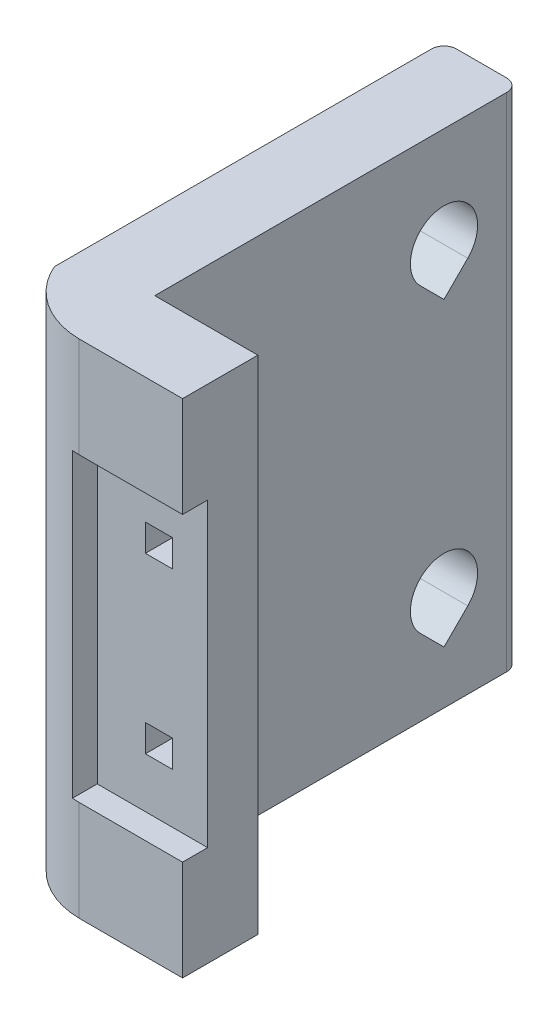
ISO-10303-21;
HEADER;
FILE_DESCRIPTION(('STEP AP214'),'2;1');
FILE_NAME('part.step','',(''),(''),'','','');
FILE_SCHEMA(('AUTOMOTIVE_DESIGN { 1 0 10303 214 1 1 1 1 }'));
ENDSEC;
DATA;
#1=APPLICATION_CONTEXT('core data for automotive mechanical design processes');
#2=APPLICATION_PROTOCOL_DEFINITION('international standard','automotive_design',2000,#1);
#3=PRODUCT_CONTEXT('',#1,'mechanical');
#4=PRODUCT('Part','Part','',(#3));
#5=PRODUCT_RELATED_PRODUCT_CATEGORY('part','',(#4));
#6=PRODUCT_DEFINITION_FORMATION('','',#4);
#7=PRODUCT_DEFINITION_CONTEXT('part definition',#1,'design');
#8=PRODUCT_DEFINITION('design','',#6,#7);
#9=PRODUCT_DEFINITION_SHAPE('','',#8);
#10=(LENGTH_UNIT() NAMED_UNIT(*) SI_UNIT(.MILLI.,.METRE.));
#11=(NAMED_UNIT(*) PLANE_ANGLE_UNIT() SI_UNIT($,.RADIAN.));
#12=(NAMED_UNIT(*) SI_UNIT($,.STERADIAN.) SOLID_ANGLE_UNIT());
#13=UNCERTAINTY_MEASURE_WITH_UNIT(LENGTH_MEASURE(1.E-05),#10,'distance_accuracy_value','');
#14=(GEOMETRIC_REPRESENTATION_CONTEXT(3) GLOBAL_UNCERTAINTY_ASSIGNED_CONTEXT((#13)) GLOBAL_UNIT_ASSIGNED_CONTEXT((#10,
#11,#12)) REPRESENTATION_CONTEXT('',''));
#15=CARTESIAN_POINT('',(0.,0.,0.));
#16=DIRECTION('',(0.,0.,1.));
#17=DIRECTION('',(1.,0.,0.));
#18=AXIS2_PLACEMENT_3D('',#15,#16,#17);
#19=CARTESIAN_POINT('',(16.5393794749403,100.,20.3051089855569));
#20=DIRECTION('',(0.,0.,-1.));
#21=DIRECTION('',(-1.,0.,0.));
#22=AXIS2_PLACEMENT_3D('',#19,#20,#21);
#23=PLANE('',#22);
#24=DIRECTION('',(0.,-1.,0.));
#25=VECTOR('',#24,1.);
#26=CARTESIAN_POINT('',(37.0851262229075,100.,20.3051089855569));
#27=LINE('',#26,#25);
#28=CARTESIAN_POINT('',(37.0851262229075,20.,20.3051089855569));
#29=VERTEX_POINT('',#28);
#30=CARTESIAN_POINT('',(37.0851262229075,0.,20.3051089855569));
#31=VERTEX_POINT('',#30);
#32=EDGE_CURVE('E435',#29,#31,#27,.T.);
#33=ORIENTED_EDGE('',*,*,#32,.F.);
#34=DIRECTION('',(1.,0.,0.));
#35=VECTOR('',#34,1.);
#36=CARTESIAN_POINT('',(37.0851262229075,20.,20.3051089855569));
#37=LINE('',#36,#35);
#38=CARTESIAN_POINT('',(16.4627404365741,20.,20.3051089855569));
#39=VERTEX_POINT('',#38);
#40=EDGE_CURVE('E256',#39,#29,#37,.T.);
#41=ORIENTED_EDGE('',*,*,#40,.F.);
#42=DIRECTION('',(0.,-1.,0.));
#43=VECTOR('',#42,1.);
#44=CARTESIAN_POINT('',(16.4627404365741,100.,20.3051089855569));
#45=LINE('',#44,#43);
#46=CARTESIAN_POINT('',(16.4627404365741,0.,20.3051089855569));
#47=VERTEX_POINT('',#46);
#48=EDGE_CURVE('E438',#39,#47,#45,.T.);
#49=ORIENTED_EDGE('',*,*,#48,.T.);
#50=DIRECTION('',(1.,0.,0.));
#51=VECTOR('',#50,1.);
#52=CARTESIAN_POINT('',(16.5393794749403,0.,20.3051089855569));
#53=LINE('',#52,#51);
#54=EDGE_CURVE('E413',#47,#31,#53,.T.);
#55=ORIENTED_EDGE('',*,*,#54,.T.);
#56=EDGE_LOOP('',(#33,#41,#49,#55));
#57=FACE_BOUND('',#56,.T.);
#58=ADVANCED_FACE('F45',(#57),#23,.F.);
#59=CARTESIAN_POINT('',(1.5393794749403,100.,10.3051089855569));
#60=DIRECTION('',(1.,0.,0.));
#61=DIRECTION('',(0.,0.,-1.));
#62=AXIS2_PLACEMENT_3D('',#59,#60,#61);
#63=PLANE('',#62);
#64=DIRECTION('',(0.,-0.707106781186553,0.707106781186542));
#65=VECTOR('',#64,1.);
#66=CARTESIAN_POINT('',(1.5393794749403,70.5247691321003,-52.3448910144431));
#67=LINE('',#66,#65);
#68=CARTESIAN_POINT('',(1.53937947494029,75.2623845660502,-57.082506448393));
#69=VERTEX_POINT('',#68);
#70=CARTESIAN_POINT('',(1.5393794749403,70.5247691321003,-52.3448910144431));
#71=VERTEX_POINT('',#70);
#72=EDGE_CURVE('E345',#69,#71,#67,.T.);
#73=ORIENTED_EDGE('',*,*,#72,.F.);
#74=CARTESIAN_POINT('',(1.5393794749403,80.,-52.3448910144431));
#75=DIRECTION('',(-1.,0.,0.));
#76=DIRECTION('',(0.,0.,1.));
#77=AXIS2_PLACEMENT_3D('',#74,#75,#76);
#78=CIRCLE('',#77,6.69999999999996);
#79=CARTESIAN_POINT('',(1.5393794749403,75.2623845660501,-47.6072755804933));
#80=VERTEX_POINT('',#79);
#81=EDGE_CURVE('E342',#80,#69,#78,.T.);
#82=ORIENTED_EDGE('',*,*,#81,.F.);
#83=DIRECTION('',(0.,0.707106781186546,0.707106781186549));
#84=VECTOR('',#83,1.);
#85=CARTESIAN_POINT('',(1.5393794749403,75.2623845660501,-47.6072755804933));
#86=LINE('',#85,#84);
#87=EDGE_CURVE('E350',#71,#80,#86,.T.);
#88=ORIENTED_EDGE('',*,*,#87,.F.);
#89=EDGE_LOOP('',(#73,#82,#88));
#90=FACE_BOUND('',#89,.T.);
#91=DIRECTION('',(0.,0.707106781186551,0.707106781186544));
#92=VECTOR('',#91,1.);
#93=CARTESIAN_POINT('',(1.5393794749403,10.5247691321002,-52.3448910144431));
#94=LINE('',#93,#92);
#95=CARTESIAN_POINT('',(1.53937947494029,10.5247691321002,-52.3448910144431));
#96=VERTEX_POINT('',#95);
#97=CARTESIAN_POINT('',(1.5393794749403,15.2623845660502,-47.6072755804932));
#98=VERTEX_POINT('',#97);
#99=EDGE_CURVE('E378',#96,#98,#94,.T.);
#100=ORIENTED_EDGE('',*,*,#99,.F.);
#101=DIRECTION('',(0.,-0.707106781186551,0.707106781186544));
#102=VECTOR('',#101,1.);
#103=CARTESIAN_POINT('',(1.5393794749403,10.5247691321002,-52.3448910144431));
#104=LINE('',#103,#102);
#105=CARTESIAN_POINT('',(1.5393794749403,15.2623845660502,-57.082506448393));
#106=VERTEX_POINT('',#105);
#107=EDGE_CURVE('E346',#106,#96,#104,.T.);
#108=ORIENTED_EDGE('',*,*,#107,.F.);
#109=CARTESIAN_POINT('',(1.5393794749403,20.,-52.3448910144431));
#110=DIRECTION('',(-1.,0.,0.));
#111=DIRECTION('',(0.,0.,-1.));
#112=AXIS2_PLACEMENT_3D('',#109,#110,#111);
#113=CIRCLE('',#112,6.7);
#114=EDGE_CURVE('E369',#98,#106,#113,.T.);
#115=ORIENTED_EDGE('',*,*,#114,.F.);
#116=EDGE_LOOP('',(#100,#108,#115));
#117=FACE_BOUND('',#116,.T.);
#118=DIRECTION('',(0.,0.,1.));
#119=VECTOR('',#118,1.);
#120=CARTESIAN_POINT('',(1.5393794749403,100.,10.3051089855569));
#121=LINE('',#120,#119);
#122=CARTESIAN_POINT('',(1.53937947494029,100.,-64.8448910144431));
#123=VERTEX_POINT('',#122);
#124=CARTESIAN_POINT('',(1.5393794749403,100.,10.3051089855569));
#125=VERTEX_POINT('',#124);
#126=EDGE_CURVE('E384',#123,#125,#121,.T.);
#127=ORIENTED_EDGE('',*,*,#126,.F.);
#128=DIRECTION('',(0.,-1.,0.));
#129=VECTOR('',#128,1.);
#130=CARTESIAN_POINT('',(1.53937947494029,100.,-64.8448910144431));
#131=LINE('',#130,#129);
#132=CARTESIAN_POINT('',(1.53937947494029,0.,-64.8448910144431));
#133=VERTEX_POINT('',#132);
#134=EDGE_CURVE('E511',#123,#133,#131,.T.);
#135=ORIENTED_EDGE('',*,*,#134,.T.);
#136=DIRECTION('',(0.,0.,1.));
#137=VECTOR('',#136,1.);
#138=CARTESIAN_POINT('',(1.5393794749403,0.,10.3051089855569));
#139=LINE('',#138,#137);
#140=CARTESIAN_POINT('',(1.5393794749403,0.,10.3051089855569));
#141=VERTEX_POINT('',#140);
#142=EDGE_CURVE('E358',#133,#141,#139,.T.);
#143=ORIENTED_EDGE('',*,*,#142,.T.);
#144=DIRECTION('',(0.,-1.,0.));
#145=VECTOR('',#144,1.);
#146=CARTESIAN_POINT('',(1.5393794749403,100.,10.3051089855569));
#147=LINE('',#146,#145);
#148=EDGE_CURVE('E443',#125,#141,#147,.T.);
#149=ORIENTED_EDGE('',*,*,#148,.F.);
#150=EDGE_LOOP('',(#127,#135,#143,#149));
#151=FACE_BOUND('',#150,.T.);
#152=ADVANCED_FACE('F539',(#90,#117,#151),#63,.F.);
#153=CARTESIAN_POINT('',(16.733940297207,100.,3.7650525246991));
#154=DIRECTION('',(0.,-1.,0.));
#155=DIRECTION('',(0.,0.,-1.));
#156=AXIS2_PLACEMENT_3D('',#153,#154,#155);
#157=CYLINDRICAL_SURFACE('',#156,16.5422796824612);
#158=ORIENTED_EDGE('',*,*,#48,.F.);
#159=CARTESIAN_POINT('',(16.733940297207,20.,3.7650525246991));
#160=DIRECTION('',(0.,-1.,0.));
#161=DIRECTION('',(0.,0.,-1.));
#162=AXIS2_PLACEMENT_3D('',#159,#160,#161);
#163=CIRCLE('',#162,16.5422796824612);
#164=CARTESIAN_POINT('',(15.0851262229075,20.,20.2249562073202));
#165=VERTEX_POINT('',#164);
#166=EDGE_CURVE('E305',#39,#165,#163,.T.);
#167=ORIENTED_EDGE('',*,*,#166,.T.);
#168=DIRECTION('',(0.,-1.,0.));
#169=VECTOR('',#168,1.);
#170=CARTESIAN_POINT('',(15.0851262229075,100.,20.2249562073202));
#171=LINE('',#170,#169);
#172=CARTESIAN_POINT('',(15.0851262229075,80.,20.2249562073202));
#173=VERTEX_POINT('',#172);
#174=EDGE_CURVE('E507',#165,#173,#171,.F.);
#175=ORIENTED_EDGE('',*,*,#174,.T.);
#176=CARTESIAN_POINT('',(16.733940297207,80.,3.7650525246991));
#177=DIRECTION('',(0.,1.,0.));
#178=DIRECTION('',(0.,0.,1.));
#179=AXIS2_PLACEMENT_3D('',#176,#177,#178);
#180=CIRCLE('',#179,16.5422796824612);
#181=CARTESIAN_POINT('',(16.4627404365741,80.,20.3051089855569));
#182=VERTEX_POINT('',#181);
#183=EDGE_CURVE('E301',#173,#182,#180,.T.);
#184=ORIENTED_EDGE('',*,*,#183,.T.);
#185=CARTESIAN_POINT('',(16.4627404365741,100.,20.3051089855569));
#186=VERTEX_POINT('',#185);
#187=EDGE_CURVE('E439',#186,#182,#45,.T.);
#188=ORIENTED_EDGE('',*,*,#187,.F.);
#189=CARTESIAN_POINT('',(16.733940297207,100.,3.7650525246991));
#190=DIRECTION('',(0.,1.,0.));
#191=DIRECTION('',(0.,0.,-1.));
#192=AXIS2_PLACEMENT_3D('',#189,#190,#191);
#193=CIRCLE('',#192,16.5422796824612);
#194=EDGE_CURVE('E387',#125,#186,#193,.T.);
#195=ORIENTED_EDGE('',*,*,#194,.F.);
#196=ORIENTED_EDGE('',*,*,#148,.T.);
#197=CARTESIAN_POINT('',(16.733940297207,0.,3.7650525246991));
#198=DIRECTION('',(0.,1.,0.));
#199=DIRECTION('',(0.,0.,-1.));
#200=AXIS2_PLACEMENT_3D('',#197,#198,#199);
#201=CIRCLE('',#200,16.5422796824612);
#202=EDGE_CURVE('E409',#141,#47,#201,.T.);
#203=ORIENTED_EDGE('',*,*,#202,.T.);
#204=EDGE_LOOP('',(#158,#167,#175,#184,#188,#195,#196,#203));
#205=FACE_BOUND('',#204,.T.);
#206=ADVANCED_FACE('F581',(#205),#157,.T.);
#207=ORIENTED_EDGE('',*,*,#187,.T.);
#208=DIRECTION('',(-1.,0.,0.));
#209=VECTOR('',#208,1.);
#210=CARTESIAN_POINT('',(37.0851262229075,80.,20.3051089855569));
#211=LINE('',#210,#209);
#212=CARTESIAN_POINT('',(37.0851262229075,80.,20.3051089855569));
#213=VERTEX_POINT('',#212);
#214=EDGE_CURVE('E575',#213,#182,#211,.T.);
#215=ORIENTED_EDGE('',*,*,#214,.F.);
#216=CARTESIAN_POINT('',(37.0851262229075,100.,20.3051089855569));
#217=VERTEX_POINT('',#216);
#218=EDGE_CURVE('E262',#217,#213,#27,.T.);
#219=ORIENTED_EDGE('',*,*,#218,.F.);
#220=DIRECTION('',(1.,0.,0.));
#221=VECTOR('',#220,1.);
#222=CARTESIAN_POINT('',(16.5393794749403,100.,20.3051089855569));
#223=LINE('',#222,#221);
#224=EDGE_CURVE('E391',#186,#217,#223,.T.);
#225=ORIENTED_EDGE('',*,*,#224,.F.);
#226=EDGE_LOOP('',(#207,#215,#219,#225));
#227=FACE_BOUND('',#226,.T.);
#228=ADVANCED_FACE('F598',(#227),#23,.F.);
#229=CARTESIAN_POINT('',(37.0851262229075,100.,20.3051089855569));
#230=DIRECTION('',(-1.,0.,0.));
#231=DIRECTION('',(0.,0.,1.));
#232=AXIS2_PLACEMENT_3D('',#229,#230,#231);
#233=PLANE('',#232);
#234=DIRECTION('',(0.,1.,0.));
#235=VECTOR('',#234,1.);
#236=CARTESIAN_POINT('',(37.0851262229075,80.,15.3051089855569));
#237=LINE('',#236,#235);
#238=CARTESIAN_POINT('',(37.0851262229075,20.,15.3051089855569));
#239=VERTEX_POINT('',#238);
#240=CARTESIAN_POINT('',(37.0851262229075,80.,15.3051089855569));
#241=VERTEX_POINT('',#240);
#242=EDGE_CURVE('E245',#239,#241,#237,.T.);
#243=ORIENTED_EDGE('',*,*,#242,.F.);
#244=DIRECTION('',(0.,0.,1.));
#245=VECTOR('',#244,1.);
#246=CARTESIAN_POINT('',(37.0851262229075,20.,15.3051089855569));
#247=LINE('',#246,#245);
#248=EDGE_CURVE('E277',#239,#29,#247,.T.);
#249=ORIENTED_EDGE('',*,*,#248,.T.);
#250=ORIENTED_EDGE('',*,*,#32,.T.);
#251=DIRECTION('',(0.,0.,-1.));
#252=VECTOR('',#251,1.);
#253=CARTESIAN_POINT('',(37.0851262229075,0.,20.3051089855569));
#254=LINE('',#253,#252);
#255=CARTESIAN_POINT('',(37.0851262229075,0.,5.30510898555687));
#256=VERTEX_POINT('',#255);
#257=EDGE_CURVE('E417',#31,#256,#254,.T.);
#258=ORIENTED_EDGE('',*,*,#257,.T.);
#259=DIRECTION('',(0.,-1.,0.));
#260=VECTOR('',#259,1.);
#261=CARTESIAN_POINT('',(37.0851262229075,100.,5.30510898555687));
#262=LINE('',#261,#260);
#263=CARTESIAN_POINT('',(37.0851262229075,100.,5.30510898555687));
#264=VERTEX_POINT('',#263);
#265=EDGE_CURVE('E431',#264,#256,#262,.T.);
#266=ORIENTED_EDGE('',*,*,#265,.F.);
#267=DIRECTION('',(0.,0.,-1.));
#268=VECTOR('',#267,1.);
#269=CARTESIAN_POINT('',(37.0851262229075,100.,20.3051089855569));
#270=LINE('',#269,#268);
#271=EDGE_CURVE('E394',#217,#264,#270,.T.);
#272=ORIENTED_EDGE('',*,*,#271,.F.);
#273=ORIENTED_EDGE('',*,*,#218,.T.);
#274=DIRECTION('',(0.,0.,1.));
#275=VECTOR('',#274,1.);
#276=CARTESIAN_POINT('',(37.0851262229075,80.,15.3051089855569));
#277=LINE('',#276,#275);
#278=EDGE_CURVE('E236',#241,#213,#277,.T.);
#279=ORIENTED_EDGE('',*,*,#278,.F.);
#280=EDGE_LOOP('',(#243,#249,#250,#258,#266,#272,#273,#279));
#281=FACE_BOUND('',#280,.T.);
#282=ADVANCED_FACE('F259',(#281),#233,.F.);
#283=CARTESIAN_POINT('',(16.5393794749403,100.,5.30510898555687));
#284=DIRECTION('',(0.,0.,1.));
#285=DIRECTION('',(1.,0.,0.));
#286=AXIS2_PLACEMENT_3D('',#283,#284,#285);
#287=PLANE('',#286);
#288=DIRECTION('',(-1.,0.,0.));
#289=VECTOR('',#288,1.);
#290=CARTESIAN_POINT('',(16.5393794749403,35.4,5.30510898555687));
#291=LINE('',#290,#289);
#292=CARTESIAN_POINT('',(30.0851262229075,35.4,5.30510898555687));
#293=VERTEX_POINT('',#292);
#294=CARTESIAN_POINT('',(24.6851262229075,35.4,5.30510898555687));
#295=VERTEX_POINT('',#294);
#296=EDGE_CURVE('E495',#293,#295,#291,.T.);
#297=ORIENTED_EDGE('',*,*,#296,.T.);
#298=DIRECTION('',(0.,-1.,0.));
#299=VECTOR('',#298,1.);
#300=CARTESIAN_POINT('',(24.6851262229075,100.,5.30510898555687));
#301=LINE('',#300,#299);
#302=CARTESIAN_POINT('',(24.6851262229075,30.,5.30510898555687));
#303=VERTEX_POINT('',#302);
#304=EDGE_CURVE('E499',#295,#303,#301,.T.);
#305=ORIENTED_EDGE('',*,*,#304,.T.);
#306=DIRECTION('',(1.,0.,0.));
#307=VECTOR('',#306,1.);
#308=CARTESIAN_POINT('',(16.5393794749403,30.,5.30510898555687));
#309=LINE('',#308,#307);
#310=CARTESIAN_POINT('',(30.0851262229075,30.,5.30510898555687));
#311=VERTEX_POINT('',#310);
#312=EDGE_CURVE('E487',#303,#311,#309,.T.);
#313=ORIENTED_EDGE('',*,*,#312,.T.);
#314=DIRECTION('',(0.,1.,0.));
#315=VECTOR('',#314,1.);
#316=CARTESIAN_POINT('',(30.0851262229075,100.,5.30510898555687));
#317=LINE('',#316,#315);
#318=EDGE_CURVE('E491',#311,#293,#317,.T.);
#319=ORIENTED_EDGE('',*,*,#318,.T.);
#320=EDGE_LOOP('',(#297,#305,#313,#319));
#321=FACE_BOUND('',#320,.T.);
#322=DIRECTION('',(0.,-1.,0.));
#323=VECTOR('',#322,1.);
#324=CARTESIAN_POINT('',(24.6851262229075,100.,5.30510898555687));
#325=LINE('',#324,#323);
#326=CARTESIAN_POINT('',(24.6851262229075,70.,5.30510898555687));
#327=VERTEX_POINT('',#326);
#328=CARTESIAN_POINT('',(24.6851262229075,64.6,5.30510898555687));
#329=VERTEX_POINT('',#328);
#330=EDGE_CURVE('E479',#327,#329,#325,.T.);
#331=ORIENTED_EDGE('',*,*,#330,.T.);
#332=DIRECTION('',(1.,0.,0.));
#333=VECTOR('',#332,1.);
#334=CARTESIAN_POINT('',(16.5393794749404,64.6,5.30510898555687));
#335=LINE('',#334,#333);
#336=CARTESIAN_POINT('',(30.0851262229075,64.6,5.30510898555687));
#337=VERTEX_POINT('',#336);
#338=EDGE_CURVE('E483',#329,#337,#335,.T.);
#339=ORIENTED_EDGE('',*,*,#338,.T.);
#340=DIRECTION('',(0.,1.,0.));
#341=VECTOR('',#340,1.);
#342=CARTESIAN_POINT('',(30.0851262229075,100.,5.30510898555687));
#343=LINE('',#342,#341);
#344=CARTESIAN_POINT('',(30.0851262229075,70.,5.30510898555687));
#345=VERTEX_POINT('',#344);
#346=EDGE_CURVE('E471',#337,#345,#343,.T.);
#347=ORIENTED_EDGE('',*,*,#346,.T.);
#348=DIRECTION('',(-1.,0.,0.));
#349=VECTOR('',#348,1.);
#350=CARTESIAN_POINT('',(16.5393794749403,70.,5.30510898555687));
#351=LINE('',#350,#349);
#352=EDGE_CURVE('E475',#345,#327,#351,.T.);
#353=ORIENTED_EDGE('',*,*,#352,.T.);
#354=EDGE_LOOP('',(#331,#339,#347,#353));
#355=FACE_BOUND('',#354,.T.);
#356=DIRECTION('',(-1.,0.,0.));
#357=VECTOR('',#356,1.);
#358=CARTESIAN_POINT('',(16.5393794749403,0.,5.30510898555687));
#359=LINE('',#358,#357);
#360=CARTESIAN_POINT('',(16.5393794749403,0.,5.30510898555687));
#361=VERTEX_POINT('',#360);
#362=EDGE_CURVE('E420',#256,#361,#359,.T.);
#363=ORIENTED_EDGE('',*,*,#362,.T.);
#364=DIRECTION('',(0.,-1.,0.));
#365=VECTOR('',#364,1.);
#366=CARTESIAN_POINT('',(16.5393794749403,100.,5.30510898555687));
#367=LINE('',#366,#365);
#368=CARTESIAN_POINT('',(16.5393794749403,100.,5.30510898555687));
#369=VERTEX_POINT('',#368);
#370=EDGE_CURVE('E406',#369,#361,#367,.T.);
#371=ORIENTED_EDGE('',*,*,#370,.F.);
#372=DIRECTION('',(-1.,0.,0.));
#373=VECTOR('',#372,1.);
#374=CARTESIAN_POINT('',(16.5393794749403,100.,5.30510898555687));
#375=LINE('',#374,#373);
#376=EDGE_CURVE('E397',#264,#369,#375,.T.);
#377=ORIENTED_EDGE('',*,*,#376,.F.);
#378=ORIENTED_EDGE('',*,*,#265,.T.);
#379=EDGE_LOOP('',(#363,#371,#377,#378));
#380=FACE_BOUND('',#379,.T.);
#381=ADVANCED_FACE('F556',(#321,#355,#380),#287,.F.);
#382=CARTESIAN_POINT('',(16.5393794749403,100.,5.30510898555687));
#383=DIRECTION('',(-1.,0.,0.));
#384=DIRECTION('',(0.,0.,1.));
#385=AXIS2_PLACEMENT_3D('',#382,#383,#384);
#386=PLANE('',#385);
#387=DIRECTION('',(0.,0.707106781186546,0.707106781186549));
#388=VECTOR('',#387,1.);
#389=CARTESIAN_POINT('',(16.5393794749403,114.08738456605,-8.78227558049314));
#390=LINE('',#389,#388);
#391=CARTESIAN_POINT('',(16.5393794749403,70.5247691321003,-52.3448910144431));
#392=VERTEX_POINT('',#391);
#393=CARTESIAN_POINT('',(16.5393794749403,75.2623845660501,-47.6072755804933));
#394=VERTEX_POINT('',#393);
#395=EDGE_CURVE('E463',#392,#394,#390,.T.);
#396=ORIENTED_EDGE('',*,*,#395,.T.);
#397=CARTESIAN_POINT('',(16.5393794749403,80.,-52.3448910144431));
#398=DIRECTION('',(-1.,0.,0.));
#399=DIRECTION('',(0.,0.,1.));
#400=AXIS2_PLACEMENT_3D('',#397,#398,#399);
#401=CIRCLE('',#400,6.69999999999996);
#402=CARTESIAN_POINT('',(16.5393794749403,75.2623845660502,-57.082506448393));
#403=VERTEX_POINT('',#402);
#404=EDGE_CURVE('E467',#394,#403,#401,.T.);
#405=ORIENTED_EDGE('',*,*,#404,.T.);
#406=DIRECTION('',(0.,-0.707106781186553,0.707106781186542));
#407=VECTOR('',#406,1.);
#408=CARTESIAN_POINT('',(16.5393794749403,56.4373845660504,-38.2575064483934));
#409=LINE('',#408,#407);
#410=EDGE_CURVE('E459',#403,#392,#409,.T.);
#411=ORIENTED_EDGE('',*,*,#410,.T.);
#412=EDGE_LOOP('',(#396,#405,#411));
#413=FACE_BOUND('',#412,.T.);
#414=CARTESIAN_POINT('',(16.5393794749403,20.,-52.3448910144431));
#415=DIRECTION('',(-1.,0.,0.));
#416=DIRECTION('',(0.,0.,1.));
#417=AXIS2_PLACEMENT_3D('',#414,#415,#416);
#418=CIRCLE('',#417,6.7);
#419=CARTESIAN_POINT('',(16.5393794749403,15.2623845660502,-47.6072755804932));
#420=VERTEX_POINT('',#419);
#421=CARTESIAN_POINT('',(16.5393794749403,15.2623845660502,-57.082506448393));
#422=VERTEX_POINT('',#421);
#423=EDGE_CURVE('E451',#420,#422,#418,.T.);
#424=ORIENTED_EDGE('',*,*,#423,.T.);
#425=DIRECTION('',(0.,-0.707106781186551,0.707106781186544));
#426=VECTOR('',#425,1.);
#427=CARTESIAN_POINT('',(16.5393794749403,26.4373845660506,-68.2575064483933));
#428=LINE('',#427,#426);
#429=CARTESIAN_POINT('',(16.5393794749403,10.5247691321002,-52.3448910144431));
#430=VERTEX_POINT('',#429);
#431=EDGE_CURVE('E455',#422,#430,#428,.T.);
#432=ORIENTED_EDGE('',*,*,#431,.T.);
#433=DIRECTION('',(0.,0.707106781186551,0.707106781186544));
#434=VECTOR('',#433,1.);
#435=CARTESIAN_POINT('',(16.5393794749403,84.0873845660506,21.2177244195065));
#436=LINE('',#435,#434);
#437=EDGE_CURVE('E447',#430,#420,#436,.T.);
#438=ORIENTED_EDGE('',*,*,#437,.T.);
#439=EDGE_LOOP('',(#424,#432,#438));
#440=FACE_BOUND('',#439,.T.);
#441=DIRECTION('',(0.,0.,-1.));
#442=VECTOR('',#441,1.);
#443=CARTESIAN_POINT('',(16.5393794749403,0.,5.30510898555687));
#444=LINE('',#443,#442);
#445=CARTESIAN_POINT('',(16.5393794749403,0.,-64.8448910144431));
#446=VERTEX_POINT('',#445);
#447=EDGE_CURVE('E423',#361,#446,#444,.T.);
#448=ORIENTED_EDGE('',*,*,#447,.T.);
#449=DIRECTION('',(0.,-1.,0.));
#450=VECTOR('',#449,1.);
#451=CARTESIAN_POINT('',(16.5393794749403,100.,-64.8448910144431));
#452=LINE('',#451,#450);
#453=CARTESIAN_POINT('',(16.5393794749403,100.,-64.8448910144431));
#454=VERTEX_POINT('',#453);
#455=EDGE_CURVE('E11',#446,#454,#452,.F.);
#456=ORIENTED_EDGE('',*,*,#455,.T.);
#457=DIRECTION('',(0.,0.,-1.));
#458=VECTOR('',#457,1.);
#459=CARTESIAN_POINT('',(16.5393794749403,100.,5.30510898555687));
#460=LINE('',#459,#458);
#461=EDGE_CURVE('E400',#369,#454,#460,.T.);
#462=ORIENTED_EDGE('',*,*,#461,.F.);
#463=ORIENTED_EDGE('',*,*,#370,.T.);
#464=EDGE_LOOP('',(#448,#456,#462,#463));
#465=FACE_BOUND('',#464,.T.);
#466=ADVANCED_FACE('F552',(#413,#440,#465),#386,.F.);
#467=CARTESIAN_POINT('',(16.5393794749403,100.,-67.3448910144431));
#468=DIRECTION('',(0.,0.,1.));
#469=DIRECTION('',(1.,0.,0.));
#470=AXIS2_PLACEMENT_3D('',#467,#468,#469);
#471=PLANE('',#470);
#472=DIRECTION('',(-1.,0.,0.));
#473=VECTOR('',#472,1.);
#474=CARTESIAN_POINT('',(16.5393794749403,0.,-67.3448910144431));
#475=LINE('',#474,#473);
#476=CARTESIAN_POINT('',(14.0393794749403,0.,-67.3448910144431));
#477=VERTEX_POINT('',#476);
#478=CARTESIAN_POINT('',(4.03937947494029,0.,-67.3448910144431));
#479=VERTEX_POINT('',#478);
#480=EDGE_CURVE('E388',#477,#479,#475,.T.);
#481=ORIENTED_EDGE('',*,*,#480,.T.);
#482=DIRECTION('',(0.,-1.,0.));
#483=VECTOR('',#482,1.);
#484=CARTESIAN_POINT('',(4.03937947494029,100.,-67.3448910144431));
#485=LINE('',#484,#483);
#486=CARTESIAN_POINT('',(4.03937947494029,100.,-67.3448910144431));
#487=VERTEX_POINT('',#486);
#488=EDGE_CURVE('E67',#479,#487,#485,.F.);
#489=ORIENTED_EDGE('',*,*,#488,.T.);
#490=DIRECTION('',(-1.,0.,0.));
#491=VECTOR('',#490,1.);
#492=CARTESIAN_POINT('',(16.5393794749403,100.,-67.3448910144431));
#493=LINE('',#492,#491);
#494=CARTESIAN_POINT('',(14.0393794749403,100.,-67.3448910144431));
#495=VERTEX_POINT('',#494);
#496=EDGE_CURVE('E403',#495,#487,#493,.T.);
#497=ORIENTED_EDGE('',*,*,#496,.F.);
#498=DIRECTION('',(0.,-1.,0.));
#499=VECTOR('',#498,1.);
#500=CARTESIAN_POINT('',(14.0393794749403,100.,-67.3448910144431));
#501=LINE('',#500,#499);
#502=EDGE_CURVE('E521',#495,#477,#501,.T.);
#503=ORIENTED_EDGE('',*,*,#502,.T.);
#504=EDGE_LOOP('',(#481,#489,#497,#503));
#505=FACE_BOUND('',#504,.T.);
#506=ADVANCED_FACE('F546',(#505),#471,.F.);
#507=CARTESIAN_POINT('',(16.733940297207,100.,3.7650525246991));
#508=DIRECTION('',(0.,-1.,0.));
#509=DIRECTION('',(0.,0.,-1.));
#510=AXIS2_PLACEMENT_3D('',#507,#508,#509);
#511=PLANE('',#510);
#512=ORIENTED_EDGE('',*,*,#496,.T.);
#513=CARTESIAN_POINT('',(4.03937947494029,100.,-64.8448910144431));
#514=DIRECTION('',(0.,-1.,0.));
#515=DIRECTION('',(0.,0.,-1.));
#516=AXIS2_PLACEMENT_3D('',#513,#514,#515);
#517=CIRCLE('',#516,2.5);
#518=EDGE_CURVE('E54',#487,#123,#517,.F.);
#519=ORIENTED_EDGE('',*,*,#518,.T.);
#520=ORIENTED_EDGE('',*,*,#126,.T.);
#521=ORIENTED_EDGE('',*,*,#194,.T.);
#522=ORIENTED_EDGE('',*,*,#224,.T.);
#523=ORIENTED_EDGE('',*,*,#271,.T.);
#524=ORIENTED_EDGE('',*,*,#376,.T.);
#525=ORIENTED_EDGE('',*,*,#461,.T.);
#526=CARTESIAN_POINT('',(14.0393794749403,100.,-64.8448910144431));
#527=DIRECTION('',(0.,-1.,0.));
#528=DIRECTION('',(0.,0.,-1.));
#529=AXIS2_PLACEMENT_3D('',#526,#527,#528);
#530=CIRCLE('',#529,2.5);
#531=EDGE_CURVE('E527',#454,#495,#530,.F.);
#532=ORIENTED_EDGE('',*,*,#531,.T.);
#533=EDGE_LOOP('',(#512,#519,#520,#521,#522,#523,#524,#525,#532));
#534=FACE_BOUND('',#533,.T.);
#535=ADVANCED_FACE('F533',(#534),#511,.F.);
#536=CARTESIAN_POINT('',(16.733940297207,0.,3.7650525246991));
#537=DIRECTION('',(0.,-1.,0.));
#538=DIRECTION('',(0.,0.,-1.));
#539=AXIS2_PLACEMENT_3D('',#536,#537,#538);
#540=PLANE('',#539);
#541=ORIENTED_EDGE('',*,*,#142,.F.);
#542=CARTESIAN_POINT('',(4.03937947494029,0.,-64.8448910144431));
#543=DIRECTION('',(0.,-1.,0.));
#544=DIRECTION('',(0.,0.,-1.));
#545=AXIS2_PLACEMENT_3D('',#542,#543,#544);
#546=CIRCLE('',#545,2.5);
#547=EDGE_CURVE('E518',#133,#479,#546,.T.);
#548=ORIENTED_EDGE('',*,*,#547,.T.);
#549=ORIENTED_EDGE('',*,*,#480,.F.);
#550=CARTESIAN_POINT('',(14.0393794749403,0.,-64.8448910144431));
#551=DIRECTION('',(0.,-1.,0.));
#552=DIRECTION('',(0.,0.,-1.));
#553=AXIS2_PLACEMENT_3D('',#550,#551,#552);
#554=CIRCLE('',#553,2.5);
#555=EDGE_CURVE('E515',#477,#446,#554,.T.);
#556=ORIENTED_EDGE('',*,*,#555,.T.);
#557=ORIENTED_EDGE('',*,*,#447,.F.);
#558=ORIENTED_EDGE('',*,*,#362,.F.);
#559=ORIENTED_EDGE('',*,*,#257,.F.);
#560=ORIENTED_EDGE('',*,*,#54,.F.);
#561=ORIENTED_EDGE('',*,*,#202,.F.);
#562=EDGE_LOOP('',(#541,#548,#549,#556,#557,#558,#559,#560,#561));
#563=FACE_BOUND('',#562,.T.);
#564=ADVANCED_FACE('F544',(#563),#540,.T.);
#565=CARTESIAN_POINT('',(37.0851262229075,10.5247691321002,-52.3448910144431));
#566=DIRECTION('',(0.,-0.707106781186544,-0.707106781186551));
#567=DIRECTION('',(0.,0.707106781186551,-0.707106781186544));
#568=AXIS2_PLACEMENT_3D('',#565,#566,#567);
#569=PLANE('',#568);
#570=DIRECTION('',(-1.,0.,0.));
#571=VECTOR('',#570,1.);
#572=CARTESIAN_POINT('',(37.0851262229075,15.2623845660502,-57.082506448393));
#573=LINE('',#572,#571);
#574=EDGE_CURVE('E314',#422,#106,#573,.T.);
#575=ORIENTED_EDGE('',*,*,#574,.T.);
#576=ORIENTED_EDGE('',*,*,#107,.T.);
#577=DIRECTION('',(-1.,0.,0.));
#578=VECTOR('',#577,1.);
#579=CARTESIAN_POINT('',(37.0851262229075,10.5247691321002,-52.3448910144431));
#580=LINE('',#579,#578);
#581=EDGE_CURVE('E365',#430,#96,#580,.T.);
#582=ORIENTED_EDGE('',*,*,#581,.F.);
#583=ORIENTED_EDGE('',*,*,#431,.F.);
#584=EDGE_LOOP('',(#575,#576,#582,#583));
#585=FACE_BOUND('',#584,.T.);
#586=ADVANCED_FACE('F669',(#585),#569,.F.);
#587=CARTESIAN_POINT('',(37.0851262229075,20.,-52.3448910144431));
#588=DIRECTION('',(-1.,0.,0.));
#589=DIRECTION('',(0.,0.,1.));
#590=AXIS2_PLACEMENT_3D('',#587,#588,#589);
#591=CYLINDRICAL_SURFACE('',#590,6.7);
#592=DIRECTION('',(-1.,0.,0.));
#593=VECTOR('',#592,1.);
#594=CARTESIAN_POINT('',(37.0851262229075,15.2623845660502,-47.6072755804932));
#595=LINE('',#594,#593);
#596=EDGE_CURVE('E370',#420,#98,#595,.T.);
#597=ORIENTED_EDGE('',*,*,#596,.T.);
#598=ORIENTED_EDGE('',*,*,#114,.T.);
#599=ORIENTED_EDGE('',*,*,#574,.F.);
#600=ORIENTED_EDGE('',*,*,#423,.F.);
#601=EDGE_LOOP('',(#597,#598,#599,#600));
#602=FACE_BOUND('',#601,.T.);
#603=ADVANCED_FACE('F672',(#602),#591,.F.);
#604=CARTESIAN_POINT('',(37.0851262229075,10.5247691321002,-52.3448910144431));
#605=DIRECTION('',(0.,-0.707106781186544,0.707106781186551));
#606=DIRECTION('',(0.,-0.707106781186551,-0.707106781186544));
#607=AXIS2_PLACEMENT_3D('',#604,#605,#606);
#608=PLANE('',#607);
#609=ORIENTED_EDGE('',*,*,#581,.T.);
#610=ORIENTED_EDGE('',*,*,#99,.T.);
#611=ORIENTED_EDGE('',*,*,#596,.F.);
#612=ORIENTED_EDGE('',*,*,#437,.F.);
#613=EDGE_LOOP('',(#609,#610,#611,#612));
#614=FACE_BOUND('',#613,.T.);
#615=ADVANCED_FACE('F667',(#614),#608,.F.);
#616=CARTESIAN_POINT('',(37.0851262229075,80.,-52.3448910144431));
#617=DIRECTION('',(-1.,0.,0.));
#618=DIRECTION('',(0.,0.,1.));
#619=AXIS2_PLACEMENT_3D('',#616,#617,#618);
#620=CYLINDRICAL_SURFACE('',#619,6.69999999999996);
#621=DIRECTION('',(-1.,0.,0.));
#622=VECTOR('',#621,1.);
#623=CARTESIAN_POINT('',(37.0851262229075,75.2623845660501,-47.6072755804933));
#624=LINE('',#623,#622);
#625=EDGE_CURVE('E355',#394,#80,#624,.T.);
#626=ORIENTED_EDGE('',*,*,#625,.T.);
#627=ORIENTED_EDGE('',*,*,#81,.T.);
#628=DIRECTION('',(-1.,0.,0.));
#629=VECTOR('',#628,1.);
#630=CARTESIAN_POINT('',(37.0851262229075,75.2623845660502,-57.082506448393));
#631=LINE('',#630,#629);
#632=EDGE_CURVE('E354',#403,#69,#631,.T.);
#633=ORIENTED_EDGE('',*,*,#632,.F.);
#634=ORIENTED_EDGE('',*,*,#404,.F.);
#635=EDGE_LOOP('',(#626,#627,#633,#634));
#636=FACE_BOUND('',#635,.T.);
#637=ADVANCED_FACE('F660',(#636),#620,.F.);
#638=CARTESIAN_POINT('',(37.0851262229075,75.2623845660501,-47.6072755804933));
#639=DIRECTION('',(0.,-0.707106781186549,0.707106781186546));
#640=DIRECTION('',(0.,-0.707106781186546,-0.707106781186549));
#641=AXIS2_PLACEMENT_3D('',#638,#639,#640);
#642=PLANE('',#641);
#643=DIRECTION('',(-1.,0.,0.));
#644=VECTOR('',#643,1.);
#645=CARTESIAN_POINT('',(37.0851262229075,70.5247691321003,-52.3448910144431));
#646=LINE('',#645,#644);
#647=EDGE_CURVE('E359',#392,#71,#646,.T.);
#648=ORIENTED_EDGE('',*,*,#647,.T.);
#649=ORIENTED_EDGE('',*,*,#87,.T.);
#650=ORIENTED_EDGE('',*,*,#625,.F.);
#651=ORIENTED_EDGE('',*,*,#395,.F.);
#652=EDGE_LOOP('',(#648,#649,#650,#651));
#653=FACE_BOUND('',#652,.T.);
#654=ADVANCED_FACE('F657',(#653),#642,.F.);
#655=CARTESIAN_POINT('',(37.0851262229075,70.5247691321003,-52.3448910144431));
#656=DIRECTION('',(0.,-0.707106781186542,-0.707106781186553));
#657=DIRECTION('',(0.,0.707106781186553,-0.707106781186542));
#658=AXIS2_PLACEMENT_3D('',#655,#656,#657);
#659=PLANE('',#658);
#660=ORIENTED_EDGE('',*,*,#632,.T.);
#661=ORIENTED_EDGE('',*,*,#72,.T.);
#662=ORIENTED_EDGE('',*,*,#647,.F.);
#663=ORIENTED_EDGE('',*,*,#410,.F.);
#664=EDGE_LOOP('',(#660,#661,#662,#663));
#665=FACE_BOUND('',#664,.T.);
#666=ADVANCED_FACE('F645',(#665),#659,.F.);
#667=CARTESIAN_POINT('',(24.6851262229075,64.6,-67.3448910144431));
#668=DIRECTION('',(0.,-1.,0.));
#669=DIRECTION('',(1.,0.,0.));
#670=AXIS2_PLACEMENT_3D('',#667,#668,#669);
#671=PLANE('',#670);
#672=DIRECTION('',(0.,0.,1.));
#673=VECTOR('',#672,1.);
#674=CARTESIAN_POINT('',(24.6851262229075,64.6,-67.3448910144431));
#675=LINE('',#674,#673);
#676=CARTESIAN_POINT('',(24.6851262229075,64.6,15.3051089855569));
#677=VERTEX_POINT('',#676);
#678=EDGE_CURVE('E309',#329,#677,#675,.T.);
#679=ORIENTED_EDGE('',*,*,#678,.T.);
#680=DIRECTION('',(1.,0.,0.));
#681=VECTOR('',#680,1.);
#682=CARTESIAN_POINT('',(24.6851262229075,64.6,15.3051089855569));
#683=LINE('',#682,#681);
#684=CARTESIAN_POINT('',(30.0851262229075,64.6,15.3051089855569));
#685=VERTEX_POINT('',#684);
#686=EDGE_CURVE('E297',#677,#685,#683,.T.);
#687=ORIENTED_EDGE('',*,*,#686,.T.);
#688=DIRECTION('',(0.,0.,1.));
#689=VECTOR('',#688,1.);
#690=CARTESIAN_POINT('',(30.0851262229075,64.6,-67.3448910144431));
#691=LINE('',#690,#689);
#692=EDGE_CURVE('E327',#337,#685,#691,.T.);
#693=ORIENTED_EDGE('',*,*,#692,.F.);
#694=ORIENTED_EDGE('',*,*,#338,.F.);
#695=EDGE_LOOP('',(#679,#687,#693,#694));
#696=FACE_BOUND('',#695,.T.);
#697=ADVANCED_FACE('F641',(#696),#671,.F.);
#698=CARTESIAN_POINT('',(24.6851262229075,64.6,-67.3448910144431));
#699=DIRECTION('',(-1.,0.,0.));
#700=DIRECTION('',(0.,-1.,0.));
#701=AXIS2_PLACEMENT_3D('',#698,#699,#700);
#702=PLANE('',#701);
#703=DIRECTION('',(0.,0.,1.));
#704=VECTOR('',#703,1.);
#705=CARTESIAN_POINT('',(24.6851262229075,70.,-67.3448910144431));
#706=LINE('',#705,#704);
#707=CARTESIAN_POINT('',(24.6851262229075,70.,15.3051089855569));
#708=VERTEX_POINT('',#707);
#709=EDGE_CURVE('E335',#327,#708,#706,.T.);
#710=ORIENTED_EDGE('',*,*,#709,.T.);
#711=DIRECTION('',(0.,-1.,0.));
#712=VECTOR('',#711,1.);
#713=CARTESIAN_POINT('',(24.6851262229075,64.6,15.3051089855569));
#714=LINE('',#713,#712);
#715=EDGE_CURVE('E293',#708,#677,#714,.T.);
#716=ORIENTED_EDGE('',*,*,#715,.T.);
#717=ORIENTED_EDGE('',*,*,#678,.F.);
#718=ORIENTED_EDGE('',*,*,#330,.F.);
#719=EDGE_LOOP('',(#710,#716,#717,#718));
#720=FACE_BOUND('',#719,.T.);
#721=ADVANCED_FACE('F644',(#720),#702,.F.);
#722=CARTESIAN_POINT('',(24.6851262229075,70.,-67.3448910144431));
#723=DIRECTION('',(0.,1.,0.));
#724=DIRECTION('',(0.,0.,1.));
#725=AXIS2_PLACEMENT_3D('',#722,#723,#724);
#726=PLANE('',#725);
#727=DIRECTION('',(0.,0.,1.));
#728=VECTOR('',#727,1.);
#729=CARTESIAN_POINT('',(30.0851262229075,70.,-67.3448910144431));
#730=LINE('',#729,#728);
#731=CARTESIAN_POINT('',(30.0851262229075,70.,15.3051089855569));
#732=VERTEX_POINT('',#731);
#733=EDGE_CURVE('E331',#345,#732,#730,.T.);
#734=ORIENTED_EDGE('',*,*,#733,.T.);
#735=DIRECTION('',(-1.,0.,0.));
#736=VECTOR('',#735,1.);
#737=CARTESIAN_POINT('',(24.6851262229075,70.,15.3051089855569));
#738=LINE('',#737,#736);
#739=EDGE_CURVE('E289',#732,#708,#738,.T.);
#740=ORIENTED_EDGE('',*,*,#739,.T.);
#741=ORIENTED_EDGE('',*,*,#709,.F.);
#742=ORIENTED_EDGE('',*,*,#352,.F.);
#743=EDGE_LOOP('',(#734,#740,#741,#742));
#744=FACE_BOUND('',#743,.T.);
#745=ADVANCED_FACE('F649',(#744),#726,.F.);
#746=CARTESIAN_POINT('',(30.0851262229075,64.6,-67.3448910144431));
#747=DIRECTION('',(1.,0.,0.));
#748=DIRECTION('',(0.,0.,-1.));
#749=AXIS2_PLACEMENT_3D('',#746,#747,#748);
#750=PLANE('',#749);
#751=ORIENTED_EDGE('',*,*,#692,.T.);
#752=DIRECTION('',(0.,1.,0.));
#753=VECTOR('',#752,1.);
#754=CARTESIAN_POINT('',(30.0851262229075,64.6,15.3051089855569));
#755=LINE('',#754,#753);
#756=EDGE_CURVE('E285',#685,#732,#755,.T.);
#757=ORIENTED_EDGE('',*,*,#756,.T.);
#758=ORIENTED_EDGE('',*,*,#733,.F.);
#759=ORIENTED_EDGE('',*,*,#346,.F.);
#760=EDGE_LOOP('',(#751,#757,#758,#759));
#761=FACE_BOUND('',#760,.T.);
#762=ADVANCED_FACE('F639',(#761),#750,.F.);
#763=CARTESIAN_POINT('',(24.6851262229075,35.4,-67.3448910144431));
#764=DIRECTION('',(-1.,0.,0.));
#765=DIRECTION('',(0.,-1.,0.));
#766=AXIS2_PLACEMENT_3D('',#763,#764,#765);
#767=PLANE('',#766);
#768=DIRECTION('',(0.,0.,1.));
#769=VECTOR('',#768,1.);
#770=CARTESIAN_POINT('',(24.6851262229075,35.4,-67.3448910144431));
#771=LINE('',#770,#769);
#772=CARTESIAN_POINT('',(24.6851262229075,35.4,15.3051089855569));
#773=VERTEX_POINT('',#772);
#774=EDGE_CURVE('E310',#295,#773,#771,.T.);
#775=ORIENTED_EDGE('',*,*,#774,.T.);
#776=DIRECTION('',(0.,-1.,0.));
#777=VECTOR('',#776,1.);
#778=CARTESIAN_POINT('',(24.6851262229075,35.4,15.3051089855569));
#779=LINE('',#778,#777);
#780=CARTESIAN_POINT('',(24.6851262229075,30.,15.3051089855569));
#781=VERTEX_POINT('',#780);
#782=EDGE_CURVE('E281',#773,#781,#779,.T.);
#783=ORIENTED_EDGE('',*,*,#782,.T.);
#784=DIRECTION('',(0.,0.,1.));
#785=VECTOR('',#784,1.);
#786=CARTESIAN_POINT('',(24.6851262229075,30.,-67.3448910144431));
#787=LINE('',#786,#785);
#788=EDGE_CURVE('E323',#303,#781,#787,.T.);
#789=ORIENTED_EDGE('',*,*,#788,.F.);
#790=ORIENTED_EDGE('',*,*,#304,.F.);
#791=EDGE_LOOP('',(#775,#783,#789,#790));
#792=FACE_BOUND('',#791,.T.);
#793=ADVANCED_FACE('F632',(#792),#767,.F.);
#794=CARTESIAN_POINT('',(24.6851262229075,35.4,-67.3448910144431));
#795=DIRECTION('',(0.,1.,0.));
#796=DIRECTION('',(0.,0.,1.));
#797=AXIS2_PLACEMENT_3D('',#794,#795,#796);
#798=PLANE('',#797);
#799=DIRECTION('',(0.,0.,1.));
#800=VECTOR('',#799,1.);
#801=CARTESIAN_POINT('',(30.0851262229075,35.4,-67.3448910144431));
#802=LINE('',#801,#800);
#803=CARTESIAN_POINT('',(30.0851262229075,35.4,15.3051089855569));
#804=VERTEX_POINT('',#803);
#805=EDGE_CURVE('E315',#293,#804,#802,.T.);
#806=ORIENTED_EDGE('',*,*,#805,.T.);
#807=DIRECTION('',(-1.,0.,0.));
#808=VECTOR('',#807,1.);
#809=CARTESIAN_POINT('',(24.6851262229075,35.4,15.3051089855569));
#810=LINE('',#809,#808);
#811=EDGE_CURVE('E276',#804,#773,#810,.T.);
#812=ORIENTED_EDGE('',*,*,#811,.T.);
#813=ORIENTED_EDGE('',*,*,#774,.F.);
#814=ORIENTED_EDGE('',*,*,#296,.F.);
#815=EDGE_LOOP('',(#806,#812,#813,#814));
#816=FACE_BOUND('',#815,.T.);
#817=ADVANCED_FACE('F629',(#816),#798,.F.);
#818=CARTESIAN_POINT('',(30.0851262229075,35.4,-67.3448910144431));
#819=DIRECTION('',(1.,0.,0.));
#820=DIRECTION('',(0.,0.,-1.));
#821=AXIS2_PLACEMENT_3D('',#818,#819,#820);
#822=PLANE('',#821);
#823=DIRECTION('',(0.,0.,1.));
#824=VECTOR('',#823,1.);
#825=CARTESIAN_POINT('',(30.0851262229075,30.,-67.3448910144431));
#826=LINE('',#825,#824);
#827=CARTESIAN_POINT('',(30.0851262229075,30.,15.3051089855569));
#828=VERTEX_POINT('',#827);
#829=EDGE_CURVE('E319',#311,#828,#826,.T.);
#830=ORIENTED_EDGE('',*,*,#829,.T.);
#831=DIRECTION('',(0.,1.,0.));
#832=VECTOR('',#831,1.);
#833=CARTESIAN_POINT('',(30.0851262229075,35.4,15.3051089855569));
#834=LINE('',#833,#832);
#835=EDGE_CURVE('E272',#828,#804,#834,.T.);
#836=ORIENTED_EDGE('',*,*,#835,.T.);
#837=ORIENTED_EDGE('',*,*,#805,.F.);
#838=ORIENTED_EDGE('',*,*,#318,.F.);
#839=EDGE_LOOP('',(#830,#836,#837,#838));
#840=FACE_BOUND('',#839,.T.);
#841=ADVANCED_FACE('F592',(#840),#822,.F.);
#842=CARTESIAN_POINT('',(24.6851262229075,30.,-67.3448910144431));
#843=DIRECTION('',(0.,-1.,0.));
#844=DIRECTION('',(0.,0.,-1.));
#845=AXIS2_PLACEMENT_3D('',#842,#843,#844);
#846=PLANE('',#845);
#847=ORIENTED_EDGE('',*,*,#788,.T.);
#848=DIRECTION('',(1.,0.,0.));
#849=VECTOR('',#848,1.);
#850=CARTESIAN_POINT('',(24.6851262229075,30.,15.3051089855569));
#851=LINE('',#850,#849);
#852=EDGE_CURVE('E503',#781,#828,#851,.T.);
#853=ORIENTED_EDGE('',*,*,#852,.T.);
#854=ORIENTED_EDGE('',*,*,#829,.F.);
#855=ORIENTED_EDGE('',*,*,#312,.F.);
#856=EDGE_LOOP('',(#847,#853,#854,#855));
#857=FACE_BOUND('',#856,.T.);
#858=ADVANCED_FACE('F585',(#857),#846,.F.);
#859=CARTESIAN_POINT('',(15.0851262229075,80.,15.3051089855569));
#860=DIRECTION('',(-1.,0.,0.));
#861=DIRECTION('',(0.,-1.,0.));
#862=AXIS2_PLACEMENT_3D('',#859,#860,#861);
#863=PLANE('',#862);
#864=DIRECTION('',(0.,0.,1.));
#865=VECTOR('',#864,1.);
#866=CARTESIAN_POINT('',(15.0851262229075,20.,15.3051089855569));
#867=LINE('',#866,#865);
#868=CARTESIAN_POINT('',(15.0851262229075,20.,15.3051089855569));
#869=VERTEX_POINT('',#868);
#870=EDGE_CURVE('E267',#869,#165,#867,.T.);
#871=ORIENTED_EDGE('',*,*,#870,.F.);
#872=DIRECTION('',(0.,-1.,0.));
#873=VECTOR('',#872,1.);
#874=CARTESIAN_POINT('',(15.0851262229075,80.,15.3051089855569));
#875=LINE('',#874,#873);
#876=CARTESIAN_POINT('',(15.0851262229075,80.,15.3051089855569));
#877=VERTEX_POINT('',#876);
#878=EDGE_CURVE('E244',#877,#869,#875,.T.);
#879=ORIENTED_EDGE('',*,*,#878,.F.);
#880=DIRECTION('',(0.,0.,1.));
#881=VECTOR('',#880,1.);
#882=CARTESIAN_POINT('',(15.0851262229075,80.,15.3051089855569));
#883=LINE('',#882,#881);
#884=EDGE_CURVE('E239',#877,#173,#883,.T.);
#885=ORIENTED_EDGE('',*,*,#884,.T.);
#886=ORIENTED_EDGE('',*,*,#174,.F.);
#887=EDGE_LOOP('',(#871,#879,#885,#886));
#888=FACE_BOUND('',#887,.T.);
#889=ADVANCED_FACE('F583',(#888),#863,.F.);
#890=CARTESIAN_POINT('',(37.0851262229075,20.,15.3051089855569));
#891=DIRECTION('',(0.,-1.,0.));
#892=DIRECTION('',(0.,0.,-1.));
#893=AXIS2_PLACEMENT_3D('',#890,#891,#892);
#894=PLANE('',#893);
#895=ORIENTED_EDGE('',*,*,#40,.T.);
#896=ORIENTED_EDGE('',*,*,#248,.F.);
#897=DIRECTION('',(1.,0.,0.));
#898=VECTOR('',#897,1.);
#899=CARTESIAN_POINT('',(37.0851262229075,20.,15.3051089855569));
#900=LINE('',#899,#898);
#901=EDGE_CURVE('E251',#869,#239,#900,.T.);
#902=ORIENTED_EDGE('',*,*,#901,.F.);
#903=ORIENTED_EDGE('',*,*,#870,.T.);
#904=ORIENTED_EDGE('',*,*,#166,.F.);
#905=EDGE_LOOP('',(#895,#896,#902,#903,#904));
#906=FACE_BOUND('',#905,.T.);
#907=ADVANCED_FACE('F580',(#906),#894,.F.);
#908=CARTESIAN_POINT('',(37.0851262229075,80.,15.3051089855569));
#909=DIRECTION('',(0.,1.,0.));
#910=DIRECTION('',(0.,0.,1.));
#911=AXIS2_PLACEMENT_3D('',#908,#909,#910);
#912=PLANE('',#911);
#913=ORIENTED_EDGE('',*,*,#884,.F.);
#914=DIRECTION('',(-1.,0.,0.));
#915=VECTOR('',#914,1.);
#916=CARTESIAN_POINT('',(37.0851262229075,80.,15.3051089855569));
#917=LINE('',#916,#915);
#918=EDGE_CURVE('E232',#241,#877,#917,.T.);
#919=ORIENTED_EDGE('',*,*,#918,.F.);
#920=ORIENTED_EDGE('',*,*,#278,.T.);
#921=ORIENTED_EDGE('',*,*,#214,.T.);
#922=ORIENTED_EDGE('',*,*,#183,.F.);
#923=EDGE_LOOP('',(#913,#919,#920,#921,#922));
#924=FACE_BOUND('',#923,.T.);
#925=ADVANCED_FACE('F234',(#924),#912,.F.);
#926=CARTESIAN_POINT('',(0.,0.,15.3051089855569));
#927=DIRECTION('',(0.,0.,-1.));
#928=DIRECTION('',(-1.,0.,0.));
#929=AXIS2_PLACEMENT_3D('',#926,#927,#928);
#930=PLANE('',#929);
#931=ORIENTED_EDGE('',*,*,#242,.T.);
#932=ORIENTED_EDGE('',*,*,#918,.T.);
#933=ORIENTED_EDGE('',*,*,#878,.T.);
#934=ORIENTED_EDGE('',*,*,#901,.T.);
#935=EDGE_LOOP('',(#931,#932,#933,#934));
#936=FACE_BOUND('',#935,.T.);
#937=ORIENTED_EDGE('',*,*,#811,.F.);
#938=ORIENTED_EDGE('',*,*,#835,.F.);
#939=ORIENTED_EDGE('',*,*,#852,.F.);
#940=ORIENTED_EDGE('',*,*,#782,.F.);
#941=EDGE_LOOP('',(#937,#938,#939,#940));
#942=FACE_BOUND('',#941,.T.);
#943=ORIENTED_EDGE('',*,*,#715,.F.);
#944=ORIENTED_EDGE('',*,*,#739,.F.);
#945=ORIENTED_EDGE('',*,*,#756,.F.);
#946=ORIENTED_EDGE('',*,*,#686,.F.);
#947=EDGE_LOOP('',(#943,#944,#945,#946));
#948=FACE_BOUND('',#947,.T.);
#949=ADVANCED_FACE('F248',(#936,#942,#948),#930,.F.);
#950=CARTESIAN_POINT('',(4.03937947494029,100.,-64.8448910144431));
#951=DIRECTION('',(0.,-1.,0.));
#952=DIRECTION('',(0.,0.,-1.));
#953=AXIS2_PLACEMENT_3D('',#950,#951,#952);
#954=CYLINDRICAL_SURFACE('',#953,2.5);
#955=ORIENTED_EDGE('',*,*,#518,.F.);
#956=ORIENTED_EDGE('',*,*,#488,.F.);
#957=ORIENTED_EDGE('',*,*,#547,.F.);
#958=ORIENTED_EDGE('',*,*,#134,.F.);
#959=EDGE_LOOP('',(#955,#956,#957,#958));
#960=FACE_BOUND('',#959,.T.);
#961=ADVANCED_FACE('F541',(#960),#954,.T.);
#962=CARTESIAN_POINT('',(14.0393794749403,100.,-64.8448910144431));
#963=DIRECTION('',(0.,-1.,0.));
#964=DIRECTION('',(0.,0.,-1.));
#965=AXIS2_PLACEMENT_3D('',#962,#963,#964);
#966=CYLINDRICAL_SURFACE('',#965,2.5);
#967=ORIENTED_EDGE('',*,*,#531,.F.);
#968=ORIENTED_EDGE('',*,*,#455,.F.);
#969=ORIENTED_EDGE('',*,*,#555,.F.);
#970=ORIENTED_EDGE('',*,*,#502,.F.);
#971=EDGE_LOOP('',(#967,#968,#969,#970));
#972=FACE_BOUND('',#971,.T.);
#973=ADVANCED_FACE('F47',(#972),#966,.T.);
#974=CLOSED_SHELL('',(#58,#152,#206,#228,#282,#381,#466,#506,#535,#564,#586,#603,#615,#637,#654,
#666,#697,#721,#745,#762,#793,#817,#841,#858,#889,#907,#925,#949,#961,#973));
#975=MANIFOLD_SOLID_BREP('B2',#974);
#976=ADVANCED_BREP_SHAPE_REPRESENTATION('',(#18,#975),#14);
#977=SHAPE_DEFINITION_REPRESENTATION(#9,#976);
ENDSEC;
END-ISO-10303-21;
